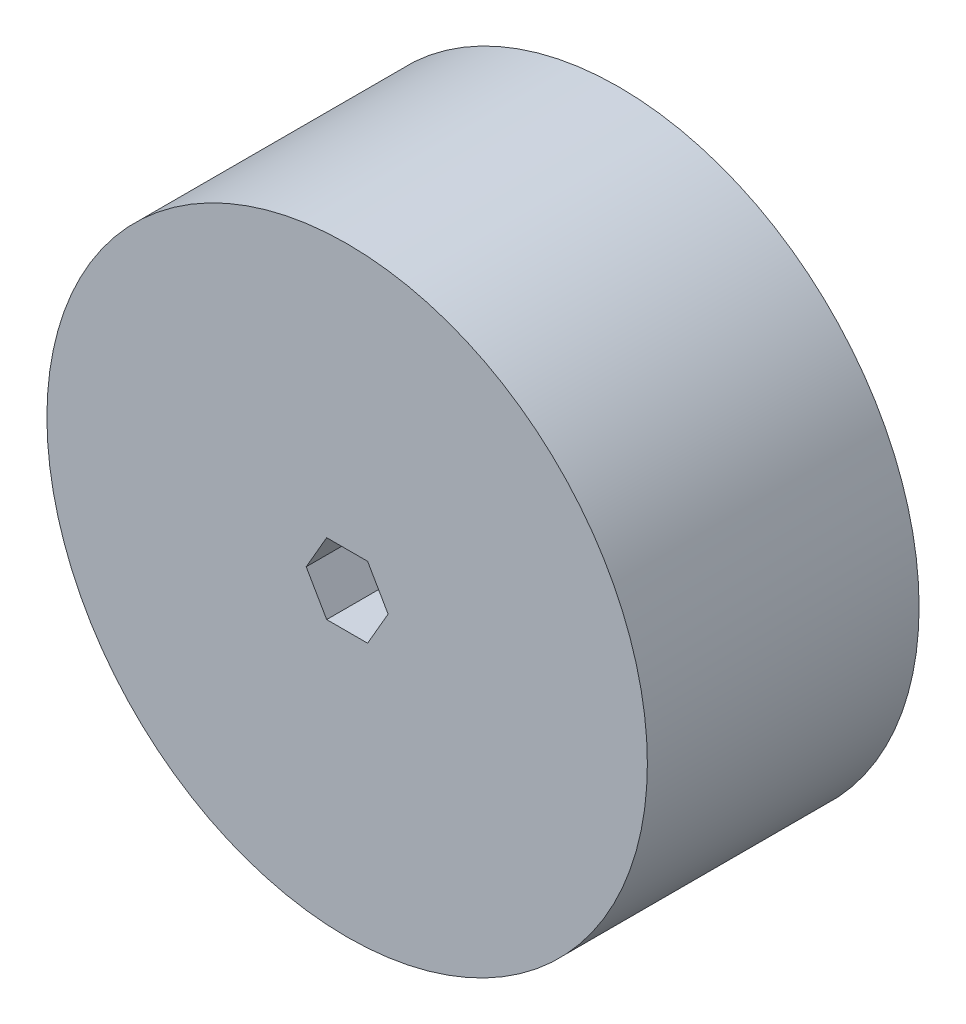
ISO-10303-21;
HEADER;
FILE_DESCRIPTION(('STEP AP214'),'2;1');
FILE_NAME('part.step','',(''),(''),'','','');
FILE_SCHEMA(('AUTOMOTIVE_DESIGN { 1 0 10303 214 1 1 1 1 }'));
ENDSEC;
DATA;
#1=APPLICATION_CONTEXT('core data for automotive mechanical design processes');
#2=APPLICATION_PROTOCOL_DEFINITION('international standard','automotive_design',2000,#1);
#3=PRODUCT_CONTEXT('',#1,'mechanical');
#4=PRODUCT('Part','Part','',(#3));
#5=PRODUCT_RELATED_PRODUCT_CATEGORY('part','',(#4));
#6=PRODUCT_DEFINITION_FORMATION('','',#4);
#7=PRODUCT_DEFINITION_CONTEXT('part definition',#1,'design');
#8=PRODUCT_DEFINITION('design','',#6,#7);
#9=PRODUCT_DEFINITION_SHAPE('','',#8);
#10=(LENGTH_UNIT() NAMED_UNIT(*) SI_UNIT(.MILLI.,.METRE.));
#11=(NAMED_UNIT(*) PLANE_ANGLE_UNIT() SI_UNIT($,.RADIAN.));
#12=(NAMED_UNIT(*) SI_UNIT($,.STERADIAN.) SOLID_ANGLE_UNIT());
#13=UNCERTAINTY_MEASURE_WITH_UNIT(LENGTH_MEASURE(1.E-05),#10,'distance_accuracy_value','');
#14=(GEOMETRIC_REPRESENTATION_CONTEXT(3) GLOBAL_UNCERTAINTY_ASSIGNED_CONTEXT((#13)) GLOBAL_UNIT_ASSIGNED_CONTEXT((#10,
#11,#12)) REPRESENTATION_CONTEXT('',''));
#15=CARTESIAN_POINT('',(0.,0.,0.));
#16=DIRECTION('',(0.,0.,1.));
#17=DIRECTION('',(1.,0.,0.));
#18=AXIS2_PLACEMENT_3D('',#15,#16,#17);
#19=CARTESIAN_POINT('',(0.,6.,45.974));
#20=DIRECTION('',(0.,1.,0.));
#21=DIRECTION('',(0.,0.,1.));
#22=AXIS2_PLACEMENT_3D('',#19,#20,#21);
#23=PLANE('',#22);
#24=DIRECTION('',(0.,0.,-1.));
#25=VECTOR('',#24,1.);
#26=CARTESIAN_POINT('',(-3.46410161513776,6.,45.974));
#27=LINE('',#26,#25);
#28=CARTESIAN_POINT('',(-3.46410161513776,6.,45.974));
#29=VERTEX_POINT('',#28);
#30=CARTESIAN_POINT('',(-3.46410161513776,6.,25.4));
#31=VERTEX_POINT('',#30);
#32=EDGE_CURVE('E114',#29,#31,#27,.T.);
#33=ORIENTED_EDGE('',*,*,#32,.T.);
#34=DIRECTION('',(1.,0.,0.));
#35=VECTOR('',#34,1.);
#36=CARTESIAN_POINT('',(0.,6.,25.4));
#37=LINE('',#36,#35);
#38=CARTESIAN_POINT('',(3.46410161513775,6.,25.4));
#39=VERTEX_POINT('',#38);
#40=EDGE_CURVE('E58',#31,#39,#37,.T.);
#41=ORIENTED_EDGE('',*,*,#40,.T.);
#42=DIRECTION('',(0.,0.,-1.));
#43=VECTOR('',#42,1.);
#44=CARTESIAN_POINT('',(3.46410161513776,6.,45.974));
#45=LINE('',#44,#43);
#46=CARTESIAN_POINT('',(3.46410161513776,6.,45.974));
#47=VERTEX_POINT('',#46);
#48=EDGE_CURVE('E51',#47,#39,#45,.T.);
#49=ORIENTED_EDGE('',*,*,#48,.F.);
#50=DIRECTION('',(1.,0.,0.));
#51=VECTOR('',#50,1.);
#52=CARTESIAN_POINT('',(0.,6.,45.974));
#53=LINE('',#52,#51);
#54=EDGE_CURVE('E141',#29,#47,#53,.T.);
#55=ORIENTED_EDGE('',*,*,#54,.F.);
#56=EDGE_LOOP('',(#33,#41,#49,#55));
#57=FACE_BOUND('',#56,.T.);
#58=ADVANCED_FACE('F43',(#57),#23,.F.);
#59=CARTESIAN_POINT('',(5.19615242270663,3.,45.974));
#60=DIRECTION('',(0.866025403784438,0.5,0.));
#61=DIRECTION('',(-0.5,0.866025403784438,0.));
#62=AXIS2_PLACEMENT_3D('',#59,#60,#61);
#63=PLANE('',#62);
#64=ORIENTED_EDGE('',*,*,#48,.T.);
#65=DIRECTION('',(0.5,-0.866025403784438,0.));
#66=VECTOR('',#65,1.);
#67=CARTESIAN_POINT('',(5.19615242270663,3.,25.4));
#68=LINE('',#67,#66);
#69=CARTESIAN_POINT('',(6.92820323027551,0.,25.4));
#70=VERTEX_POINT('',#69);
#71=EDGE_CURVE('E137',#39,#70,#68,.T.);
#72=ORIENTED_EDGE('',*,*,#71,.T.);
#73=DIRECTION('',(0.,0.,-1.));
#74=VECTOR('',#73,1.);
#75=CARTESIAN_POINT('',(6.92820323027551,0.,45.974));
#76=LINE('',#75,#74);
#77=CARTESIAN_POINT('',(6.92820323027551,0.,45.974));
#78=VERTEX_POINT('',#77);
#79=EDGE_CURVE('E127',#78,#70,#76,.T.);
#80=ORIENTED_EDGE('',*,*,#79,.F.);
#81=DIRECTION('',(0.5,-0.866025403784438,0.));
#82=VECTOR('',#81,1.);
#83=CARTESIAN_POINT('',(5.19615242270663,3.,45.974));
#84=LINE('',#83,#82);
#85=EDGE_CURVE('E138',#47,#78,#84,.T.);
#86=ORIENTED_EDGE('',*,*,#85,.F.);
#87=EDGE_LOOP('',(#64,#72,#80,#86));
#88=FACE_BOUND('',#87,.T.);
#89=ADVANCED_FACE('F135',(#88),#63,.F.);
#90=CARTESIAN_POINT('',(5.19615242270663,-3.,45.974));
#91=DIRECTION('',(0.866025403784439,-0.5,0.));
#92=DIRECTION('',(0.5,0.866025403784439,0.));
#93=AXIS2_PLACEMENT_3D('',#90,#91,#92);
#94=PLANE('',#93);
#95=ORIENTED_EDGE('',*,*,#79,.T.);
#96=DIRECTION('',(-0.5,-0.866025403784439,0.));
#97=VECTOR('',#96,1.);
#98=CARTESIAN_POINT('',(5.19615242270663,-3.,25.4));
#99=LINE('',#98,#97);
#100=CARTESIAN_POINT('',(3.46410161513776,-6.,25.4));
#101=VERTEX_POINT('',#100);
#102=EDGE_CURVE('E148',#70,#101,#99,.T.);
#103=ORIENTED_EDGE('',*,*,#102,.T.);
#104=DIRECTION('',(0.,0.,-1.));
#105=VECTOR('',#104,1.);
#106=CARTESIAN_POINT('',(3.46410161513776,-6.,45.974));
#107=LINE('',#106,#105);
#108=CARTESIAN_POINT('',(3.46410161513776,-6.,45.974));
#109=VERTEX_POINT('',#108);
#110=EDGE_CURVE('E118',#109,#101,#107,.T.);
#111=ORIENTED_EDGE('',*,*,#110,.F.);
#112=DIRECTION('',(-0.5,-0.866025403784439,0.));
#113=VECTOR('',#112,1.);
#114=CARTESIAN_POINT('',(5.19615242270663,-3.,45.974));
#115=LINE('',#114,#113);
#116=EDGE_CURVE('E156',#78,#109,#115,.T.);
#117=ORIENTED_EDGE('',*,*,#116,.F.);
#118=EDGE_LOOP('',(#95,#103,#111,#117));
#119=FACE_BOUND('',#118,.T.);
#120=ADVANCED_FACE('F196',(#119),#94,.F.);
#121=CARTESIAN_POINT('',(0.,-6.,45.974));
#122=DIRECTION('',(0.,-1.,0.));
#123=DIRECTION('',(0.,0.,-1.));
#124=AXIS2_PLACEMENT_3D('',#121,#122,#123);
#125=PLANE('',#124);
#126=ORIENTED_EDGE('',*,*,#110,.T.);
#127=DIRECTION('',(-1.,0.,0.));
#128=VECTOR('',#127,1.);
#129=CARTESIAN_POINT('',(0.,-6.,25.4));
#130=LINE('',#129,#128);
#131=CARTESIAN_POINT('',(-3.46410161513776,-6.,25.4));
#132=VERTEX_POINT('',#131);
#133=EDGE_CURVE('E109',#101,#132,#130,.T.);
#134=ORIENTED_EDGE('',*,*,#133,.T.);
#135=DIRECTION('',(0.,0.,-1.));
#136=VECTOR('',#135,1.);
#137=CARTESIAN_POINT('',(-3.46410161513775,-6.,45.974));
#138=LINE('',#137,#136);
#139=CARTESIAN_POINT('',(-3.46410161513775,-6.,45.974));
#140=VERTEX_POINT('',#139);
#141=EDGE_CURVE('E107',#140,#132,#138,.T.);
#142=ORIENTED_EDGE('',*,*,#141,.F.);
#143=DIRECTION('',(-1.,0.,0.));
#144=VECTOR('',#143,1.);
#145=CARTESIAN_POINT('',(0.,-6.,45.974));
#146=LINE('',#145,#144);
#147=EDGE_CURVE('E159',#109,#140,#146,.T.);
#148=ORIENTED_EDGE('',*,*,#147,.F.);
#149=EDGE_LOOP('',(#126,#134,#142,#148));
#150=FACE_BOUND('',#149,.T.);
#151=ADVANCED_FACE('F200',(#150),#125,.F.);
#152=CARTESIAN_POINT('',(-5.19615242270663,-3.,45.974));
#153=DIRECTION('',(-0.866025403784439,-0.5,0.));
#154=DIRECTION('',(0.5,-0.866025403784439,0.));
#155=AXIS2_PLACEMENT_3D('',#152,#153,#154);
#156=PLANE('',#155);
#157=ORIENTED_EDGE('',*,*,#141,.T.);
#158=DIRECTION('',(-0.5,0.866025403784439,0.));
#159=VECTOR('',#158,1.);
#160=CARTESIAN_POINT('',(-5.19615242270663,-3.,25.4));
#161=LINE('',#160,#159);
#162=CARTESIAN_POINT('',(-6.92820323027551,0.,25.4));
#163=VERTEX_POINT('',#162);
#164=EDGE_CURVE('E95',#132,#163,#161,.T.);
#165=ORIENTED_EDGE('',*,*,#164,.T.);
#166=DIRECTION('',(0.,0.,-1.));
#167=VECTOR('',#166,1.);
#168=CARTESIAN_POINT('',(-6.92820323027551,0.,45.974));
#169=LINE('',#168,#167);
#170=CARTESIAN_POINT('',(-6.92820323027551,0.,45.974));
#171=VERTEX_POINT('',#170);
#172=EDGE_CURVE('E105',#171,#163,#169,.T.);
#173=ORIENTED_EDGE('',*,*,#172,.F.);
#174=DIRECTION('',(-0.5,0.866025403784439,0.));
#175=VECTOR('',#174,1.);
#176=CARTESIAN_POINT('',(-5.19615242270663,-3.,45.974));
#177=LINE('',#176,#175);
#178=EDGE_CURVE('E162',#140,#171,#177,.T.);
#179=ORIENTED_EDGE('',*,*,#178,.F.);
#180=EDGE_LOOP('',(#157,#165,#173,#179));
#181=FACE_BOUND('',#180,.T.);
#182=ADVANCED_FACE('F103',(#181),#156,.F.);
#183=CARTESIAN_POINT('',(-5.19615242270663,3.,45.974));
#184=DIRECTION('',(-0.866025403784438,0.5,0.));
#185=DIRECTION('',(-0.5,-0.866025403784438,0.));
#186=AXIS2_PLACEMENT_3D('',#183,#184,#185);
#187=PLANE('',#186);
#188=ORIENTED_EDGE('',*,*,#172,.T.);
#189=DIRECTION('',(0.5,0.866025403784438,0.));
#190=VECTOR('',#189,1.);
#191=CARTESIAN_POINT('',(-5.19615242270663,3.,25.4));
#192=LINE('',#191,#190);
#193=EDGE_CURVE('E11',#163,#31,#192,.T.);
#194=ORIENTED_EDGE('',*,*,#193,.T.);
#195=ORIENTED_EDGE('',*,*,#32,.F.);
#196=DIRECTION('',(0.5,0.866025403784438,0.));
#197=VECTOR('',#196,1.);
#198=CARTESIAN_POINT('',(-5.19615242270663,3.,45.974));
#199=LINE('',#198,#197);
#200=EDGE_CURVE('E65',#171,#29,#199,.T.);
#201=ORIENTED_EDGE('',*,*,#200,.F.);
#202=EDGE_LOOP('',(#188,#194,#195,#201));
#203=FACE_BOUND('',#202,.T.);
#204=ADVANCED_FACE('F112',(#203),#187,.F.);
#205=CARTESIAN_POINT('',(0.,0.,45.974));
#206=DIRECTION('',(0.,0.,-1.));
#207=DIRECTION('',(-1.,0.,0.));
#208=AXIS2_PLACEMENT_3D('',#205,#206,#207);
#209=CYLINDRICAL_SURFACE('',#208,50.8);
#210=CARTESIAN_POINT('',(0.,0.,45.974));
#211=DIRECTION('',(0.,0.,1.));
#212=DIRECTION('',(1.,0.,0.));
#213=AXIS2_PLACEMENT_3D('',#210,#211,#212);
#214=CIRCLE('',#213,50.8);
#215=CARTESIAN_POINT('',(50.8,0.,45.974));
#216=VERTEX_POINT('',#215);
#217=EDGE_CURVE('E120',#216,#216,#214,.T.);
#218=ORIENTED_EDGE('',*,*,#217,.F.);
#219=EDGE_LOOP('',(#218));
#220=FACE_BOUND('',#219,.T.);
#221=CARTESIAN_POINT('',(0.,0.,0.));
#222=DIRECTION('',(0.,0.,1.));
#223=DIRECTION('',(1.,0.,0.));
#224=AXIS2_PLACEMENT_3D('',#221,#222,#223);
#225=CIRCLE('',#224,50.8);
#226=CARTESIAN_POINT('',(50.8,0.,0.));
#227=VERTEX_POINT('',#226);
#228=EDGE_CURVE('E143',#227,#227,#225,.T.);
#229=ORIENTED_EDGE('',*,*,#228,.T.);
#230=EDGE_LOOP('',(#229));
#231=FACE_BOUND('',#230,.T.);
#232=ADVANCED_FACE('F173',(#220,#231),#209,.T.);
#233=CARTESIAN_POINT('',(0.,0.,45.974));
#234=DIRECTION('',(0.,0.,1.));
#235=DIRECTION('',(1.,0.,0.));
#236=AXIS2_PLACEMENT_3D('',#233,#234,#235);
#237=PLANE('',#236);
#238=ORIENTED_EDGE('',*,*,#54,.T.);
#239=ORIENTED_EDGE('',*,*,#85,.T.);
#240=ORIENTED_EDGE('',*,*,#116,.T.);
#241=ORIENTED_EDGE('',*,*,#147,.T.);
#242=ORIENTED_EDGE('',*,*,#178,.T.);
#243=ORIENTED_EDGE('',*,*,#200,.T.);
#244=EDGE_LOOP('',(#238,#239,#240,#241,#242,#243));
#245=FACE_BOUND('',#244,.T.);
#246=ORIENTED_EDGE('',*,*,#217,.T.);
#247=EDGE_LOOP('',(#246));
#248=FACE_BOUND('',#247,.T.);
#249=ADVANCED_FACE('F171',(#245,#248),#237,.T.);
#250=CARTESIAN_POINT('',(0.,0.,0.));
#251=DIRECTION('',(0.,0.,1.));
#252=DIRECTION('',(1.,0.,0.));
#253=AXIS2_PLACEMENT_3D('',#250,#251,#252);
#254=PLANE('',#253);
#255=CARTESIAN_POINT('',(0.,0.,0.));
#256=DIRECTION('',(0.,0.,1.));
#257=DIRECTION('',(1.,0.,0.));
#258=AXIS2_PLACEMENT_3D('',#255,#256,#257);
#259=CIRCLE('',#258,38.1);
#260=CARTESIAN_POINT('',(38.1,0.,0.));
#261=VERTEX_POINT('',#260);
#262=EDGE_CURVE('E331',#261,#261,#259,.T.);
#263=ORIENTED_EDGE('',*,*,#262,.T.);
#264=EDGE_LOOP('',(#263));
#265=FACE_BOUND('',#264,.T.);
#266=ORIENTED_EDGE('',*,*,#228,.F.);
#267=EDGE_LOOP('',(#266));
#268=FACE_BOUND('',#267,.T.);
#269=ADVANCED_FACE('F179',(#265,#268),#254,.F.);
#270=CARTESIAN_POINT('',(0.,0.,25.4));
#271=DIRECTION('',(0.,0.,1.));
#272=DIRECTION('',(1.,0.,0.));
#273=AXIS2_PLACEMENT_3D('',#270,#271,#272);
#274=PLANE('',#273);
#275=CARTESIAN_POINT('',(0.,0.,25.4));
#276=DIRECTION('',(0.,0.,1.));
#277=DIRECTION('',(1.,0.,0.));
#278=AXIS2_PLACEMENT_3D('',#275,#276,#277);
#279=CIRCLE('',#278,38.1);
#280=CARTESIAN_POINT('',(38.1,0.,25.4));
#281=VERTEX_POINT('',#280);
#282=EDGE_CURVE('E110',#281,#281,#279,.T.);
#283=ORIENTED_EDGE('',*,*,#282,.F.);
#284=EDGE_LOOP('',(#283));
#285=FACE_BOUND('',#284,.T.);
#286=ORIENTED_EDGE('',*,*,#193,.F.);
#287=ORIENTED_EDGE('',*,*,#164,.F.);
#288=ORIENTED_EDGE('',*,*,#133,.F.);
#289=ORIENTED_EDGE('',*,*,#102,.F.);
#290=ORIENTED_EDGE('',*,*,#71,.F.);
#291=ORIENTED_EDGE('',*,*,#40,.F.);
#292=EDGE_LOOP('',(#286,#287,#288,#289,#290,#291));
#293=FACE_BOUND('',#292,.T.);
#294=ADVANCED_FACE('F94',(#285,#293),#274,.F.);
#295=CARTESIAN_POINT('',(0.,0.,25.4));
#296=DIRECTION('',(0.,0.,-1.));
#297=DIRECTION('',(-1.,0.,0.));
#298=AXIS2_PLACEMENT_3D('',#295,#296,#297);
#299=CYLINDRICAL_SURFACE('',#298,38.1);
#300=ORIENTED_EDGE('',*,*,#282,.T.);
#301=EDGE_LOOP('',(#300));
#302=FACE_BOUND('',#301,.T.);
#303=ORIENTED_EDGE('',*,*,#262,.F.);
#304=EDGE_LOOP('',(#303));
#305=FACE_BOUND('',#304,.T.);
#306=ADVANCED_FACE('F187',(#302,#305),#299,.F.);
#307=CLOSED_SHELL('',(#58,#89,#120,#151,#182,#204,#232,#249,#269,#294,#306));
#308=MANIFOLD_SOLID_BREP('B2',#307);
#309=ADVANCED_BREP_SHAPE_REPRESENTATION('',(#18,#308),#14);
#310=SHAPE_DEFINITION_REPRESENTATION(#9,#309);
ENDSEC;
END-ISO-10303-21;
